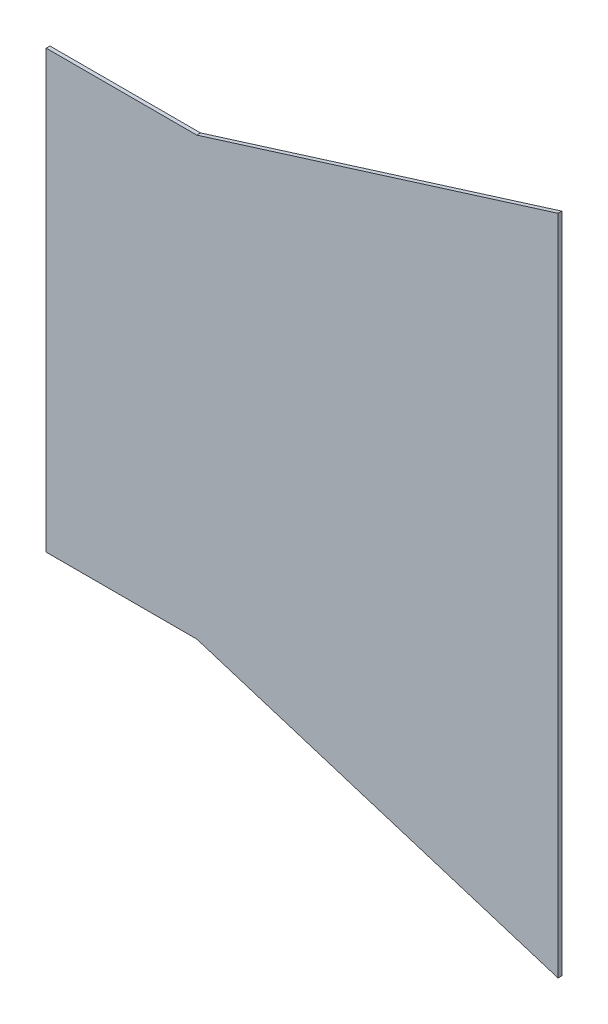
ISO-10303-21;
HEADER;
FILE_DESCRIPTION(('STEP AP214'),'2;1');
FILE_NAME('part.step','',(''),(''),'','','');
FILE_SCHEMA(('AUTOMOTIVE_DESIGN { 1 0 10303 214 1 1 1 1 }'));
ENDSEC;
DATA;
#1=APPLICATION_CONTEXT('core data for automotive mechanical design processes');
#2=APPLICATION_PROTOCOL_DEFINITION('international standard','automotive_design',2000,#1);
#3=PRODUCT_CONTEXT('',#1,'mechanical');
#4=PRODUCT('Part','Part','',(#3));
#5=PRODUCT_RELATED_PRODUCT_CATEGORY('part','',(#4));
#6=PRODUCT_DEFINITION_FORMATION('','',#4);
#7=PRODUCT_DEFINITION_CONTEXT('part definition',#1,'design');
#8=PRODUCT_DEFINITION('design','',#6,#7);
#9=PRODUCT_DEFINITION_SHAPE('','',#8);
#10=(LENGTH_UNIT() NAMED_UNIT(*) SI_UNIT(.MILLI.,.METRE.));
#11=(NAMED_UNIT(*) PLANE_ANGLE_UNIT() SI_UNIT($,.RADIAN.));
#12=(NAMED_UNIT(*) SI_UNIT($,.STERADIAN.) SOLID_ANGLE_UNIT());
#13=UNCERTAINTY_MEASURE_WITH_UNIT(LENGTH_MEASURE(1.E-05),#10,'distance_accuracy_value','');
#14=(GEOMETRIC_REPRESENTATION_CONTEXT(3) GLOBAL_UNCERTAINTY_ASSIGNED_CONTEXT((#13)) GLOBAL_UNIT_ASSIGNED_CONTEXT((#10,
#11,#12)) REPRESENTATION_CONTEXT('',''));
#15=CARTESIAN_POINT('',(0.,0.,0.));
#16=DIRECTION('',(0.,0.,1.));
#17=DIRECTION('',(1.,0.,0.));
#18=AXIS2_PLACEMENT_3D('',#15,#16,#17);
#19=CARTESIAN_POINT('',(127.,-368.3,3.175));
#20=DIRECTION('',(0.298274993135947,0.95447997803503,0.));
#21=DIRECTION('',(-0.95447997803503,0.298274993135947,0.));
#22=AXIS2_PLACEMENT_3D('',#19,#20,#21);
#23=PLANE('',#22);
#24=DIRECTION('',(0.95447997803503,-0.298274993135947,0.));
#25=VECTOR('',#24,1.);
#26=CARTESIAN_POINT('',(127.,-368.3,0.));
#27=LINE('',#26,#25);
#28=CARTESIAN_POINT('',(127.,-368.3,0.));
#29=VERTEX_POINT('',#28);
#30=CARTESIAN_POINT('',(431.8,-463.55,0.));
#31=VERTEX_POINT('',#30);
#32=EDGE_CURVE('E134',#29,#31,#27,.T.);
#33=ORIENTED_EDGE('',*,*,#32,.T.);
#34=DIRECTION('',(0.,0.,-1.));
#35=VECTOR('',#34,1.);
#36=CARTESIAN_POINT('',(431.8,-463.55,3.175));
#37=LINE('',#36,#35);
#38=CARTESIAN_POINT('',(431.8,-463.55,3.175));
#39=VERTEX_POINT('',#38);
#40=EDGE_CURVE('E11',#39,#31,#37,.T.);
#41=ORIENTED_EDGE('',*,*,#40,.F.);
#42=DIRECTION('',(0.95447997803503,-0.298274993135947,0.));
#43=VECTOR('',#42,1.);
#44=CARTESIAN_POINT('',(127.,-368.3,3.175));
#45=LINE('',#44,#43);
#46=CARTESIAN_POINT('',(127.,-368.3,3.175));
#47=VERTEX_POINT('',#46);
#48=EDGE_CURVE('E150',#47,#39,#45,.T.);
#49=ORIENTED_EDGE('',*,*,#48,.F.);
#50=DIRECTION('',(0.,0.,-1.));
#51=VECTOR('',#50,1.);
#52=CARTESIAN_POINT('',(127.,-368.3,3.175));
#53=LINE('',#52,#51);
#54=EDGE_CURVE('E130',#47,#29,#53,.T.);
#55=ORIENTED_EDGE('',*,*,#54,.T.);
#56=EDGE_LOOP('',(#33,#41,#49,#55));
#57=FACE_BOUND('',#56,.T.);
#58=ADVANCED_FACE('F45',(#57),#23,.F.);
#59=CARTESIAN_POINT('',(431.8,-463.55,3.175));
#60=DIRECTION('',(-1.,0.,0.));
#61=DIRECTION('',(0.,0.,1.));
#62=AXIS2_PLACEMENT_3D('',#59,#60,#61);
#63=PLANE('',#62);
#64=DIRECTION('',(0.,1.,0.));
#65=VECTOR('',#64,1.);
#66=CARTESIAN_POINT('',(431.8,-463.55,0.));
#67=LINE('',#66,#65);
#68=CARTESIAN_POINT('',(431.8,95.2499999999999,0.));
#69=VERTEX_POINT('',#68);
#70=EDGE_CURVE('E138',#31,#69,#67,.T.);
#71=ORIENTED_EDGE('',*,*,#70,.T.);
#72=DIRECTION('',(0.,0.,-1.));
#73=VECTOR('',#72,1.);
#74=CARTESIAN_POINT('',(431.8,95.2499999999999,3.175));
#75=LINE('',#74,#73);
#76=CARTESIAN_POINT('',(431.8,95.2499999999999,3.175));
#77=VERTEX_POINT('',#76);
#78=EDGE_CURVE('E54',#77,#69,#75,.T.);
#79=ORIENTED_EDGE('',*,*,#78,.F.);
#80=DIRECTION('',(0.,1.,0.));
#81=VECTOR('',#80,1.);
#82=CARTESIAN_POINT('',(431.8,-463.55,3.175));
#83=LINE('',#82,#81);
#84=EDGE_CURVE('E99',#39,#77,#83,.T.);
#85=ORIENTED_EDGE('',*,*,#84,.F.);
#86=ORIENTED_EDGE('',*,*,#40,.T.);
#87=EDGE_LOOP('',(#71,#79,#85,#86));
#88=FACE_BOUND('',#87,.T.);
#89=ADVANCED_FACE('F178',(#88),#63,.F.);
#90=CARTESIAN_POINT('',(431.8,95.2499999999999,3.175));
#91=DIRECTION('',(0.298274993135947,-0.95447997803503,0.));
#92=DIRECTION('',(0.95447997803503,0.298274993135947,0.));
#93=AXIS2_PLACEMENT_3D('',#90,#91,#92);
#94=PLANE('',#93);
#95=DIRECTION('',(-0.95447997803503,-0.298274993135947,0.));
#96=VECTOR('',#95,1.);
#97=CARTESIAN_POINT('',(431.8,95.2499999999999,0.));
#98=LINE('',#97,#96);
#99=CARTESIAN_POINT('',(127.,0.,0.));
#100=VERTEX_POINT('',#99);
#101=EDGE_CURVE('E141',#69,#100,#98,.T.);
#102=ORIENTED_EDGE('',*,*,#101,.T.);
#103=DIRECTION('',(0.,0.,-1.));
#104=VECTOR('',#103,1.);
#105=CARTESIAN_POINT('',(127.,0.,3.175));
#106=LINE('',#105,#104);
#107=CARTESIAN_POINT('',(127.,0.,3.175));
#108=VERTEX_POINT('',#107);
#109=EDGE_CURVE('E123',#108,#100,#106,.T.);
#110=ORIENTED_EDGE('',*,*,#109,.F.);
#111=DIRECTION('',(-0.95447997803503,-0.298274993135947,0.));
#112=VECTOR('',#111,1.);
#113=CARTESIAN_POINT('',(431.8,95.2499999999999,3.175));
#114=LINE('',#113,#112);
#115=EDGE_CURVE('E112',#77,#108,#114,.T.);
#116=ORIENTED_EDGE('',*,*,#115,.F.);
#117=ORIENTED_EDGE('',*,*,#78,.T.);
#118=EDGE_LOOP('',(#102,#110,#116,#117));
#119=FACE_BOUND('',#118,.T.);
#120=ADVANCED_FACE('F160',(#119),#94,.F.);
#121=CARTESIAN_POINT('',(0.,0.,3.175));
#122=DIRECTION('',(0.,-1.,0.));
#123=DIRECTION('',(0.,0.,-1.));
#124=AXIS2_PLACEMENT_3D('',#121,#122,#123);
#125=PLANE('',#124);
#126=DIRECTION('',(-1.,0.,0.));
#127=VECTOR('',#126,1.);
#128=CARTESIAN_POINT('',(0.,0.,0.));
#129=LINE('',#128,#127);
#130=CARTESIAN_POINT('',(0.,0.,0.));
#131=VERTEX_POINT('',#130);
#132=EDGE_CURVE('E121',#100,#131,#129,.T.);
#133=ORIENTED_EDGE('',*,*,#132,.T.);
#134=DIRECTION('',(0.,0.,-1.));
#135=VECTOR('',#134,1.);
#136=CARTESIAN_POINT('',(0.,0.,3.175));
#137=LINE('',#136,#135);
#138=CARTESIAN_POINT('',(0.,0.,3.175));
#139=VERTEX_POINT('',#138);
#140=EDGE_CURVE('E118',#139,#131,#137,.T.);
#141=ORIENTED_EDGE('',*,*,#140,.F.);
#142=DIRECTION('',(-1.,0.,0.));
#143=VECTOR('',#142,1.);
#144=CARTESIAN_POINT('',(0.,0.,3.175));
#145=LINE('',#144,#143);
#146=EDGE_CURVE('E106',#108,#139,#145,.T.);
#147=ORIENTED_EDGE('',*,*,#146,.F.);
#148=ORIENTED_EDGE('',*,*,#109,.T.);
#149=EDGE_LOOP('',(#133,#141,#147,#148));
#150=FACE_BOUND('',#149,.T.);
#151=ADVANCED_FACE('F119',(#150),#125,.F.);
#152=CARTESIAN_POINT('',(0.,-368.3,3.175));
#153=DIRECTION('',(1.,0.,0.));
#154=DIRECTION('',(0.,0.,-1.));
#155=AXIS2_PLACEMENT_3D('',#152,#153,#154);
#156=PLANE('',#155);
#157=DIRECTION('',(0.,-1.,0.));
#158=VECTOR('',#157,1.);
#159=CARTESIAN_POINT('',(0.,-368.3,0.));
#160=LINE('',#159,#158);
#161=CARTESIAN_POINT('',(0.,-368.3,0.));
#162=VERTEX_POINT('',#161);
#163=EDGE_CURVE('E85',#131,#162,#160,.T.);
#164=ORIENTED_EDGE('',*,*,#163,.T.);
#165=DIRECTION('',(0.,0.,-1.));
#166=VECTOR('',#165,1.);
#167=CARTESIAN_POINT('',(0.,-368.3,3.175));
#168=LINE('',#167,#166);
#169=CARTESIAN_POINT('',(0.,-368.3,3.175));
#170=VERTEX_POINT('',#169);
#171=EDGE_CURVE('E124',#170,#162,#168,.T.);
#172=ORIENTED_EDGE('',*,*,#171,.F.);
#173=DIRECTION('',(0.,-1.,0.));
#174=VECTOR('',#173,1.);
#175=CARTESIAN_POINT('',(0.,-368.3,3.175));
#176=LINE('',#175,#174);
#177=EDGE_CURVE('E110',#139,#170,#176,.T.);
#178=ORIENTED_EDGE('',*,*,#177,.F.);
#179=ORIENTED_EDGE('',*,*,#140,.T.);
#180=EDGE_LOOP('',(#164,#172,#178,#179));
#181=FACE_BOUND('',#180,.T.);
#182=ADVANCED_FACE('F126',(#181),#156,.F.);
#183=CARTESIAN_POINT('',(127.,-368.3,3.175));
#184=DIRECTION('',(0.,1.,0.));
#185=DIRECTION('',(0.,0.,1.));
#186=AXIS2_PLACEMENT_3D('',#183,#184,#185);
#187=PLANE('',#186);
#188=DIRECTION('',(1.,0.,0.));
#189=VECTOR('',#188,1.);
#190=CARTESIAN_POINT('',(127.,-368.3,0.));
#191=LINE('',#190,#189);
#192=EDGE_CURVE('E91',#162,#29,#191,.T.);
#193=ORIENTED_EDGE('',*,*,#192,.T.);
#194=ORIENTED_EDGE('',*,*,#54,.F.);
#195=DIRECTION('',(1.,0.,0.));
#196=VECTOR('',#195,1.);
#197=CARTESIAN_POINT('',(127.,-368.3,3.175));
#198=LINE('',#197,#196);
#199=EDGE_CURVE('E62',#170,#47,#198,.T.);
#200=ORIENTED_EDGE('',*,*,#199,.F.);
#201=ORIENTED_EDGE('',*,*,#171,.T.);
#202=EDGE_LOOP('',(#193,#194,#200,#201));
#203=FACE_BOUND('',#202,.T.);
#204=ADVANCED_FACE('F167',(#203),#187,.F.);
#205=CARTESIAN_POINT('',(0.,0.,3.175));
#206=DIRECTION('',(0.,0.,1.));
#207=DIRECTION('',(1.,0.,0.));
#208=AXIS2_PLACEMENT_3D('',#205,#206,#207);
#209=PLANE('',#208);
#210=ORIENTED_EDGE('',*,*,#48,.T.);
#211=ORIENTED_EDGE('',*,*,#84,.T.);
#212=ORIENTED_EDGE('',*,*,#115,.T.);
#213=ORIENTED_EDGE('',*,*,#146,.T.);
#214=ORIENTED_EDGE('',*,*,#177,.T.);
#215=ORIENTED_EDGE('',*,*,#199,.T.);
#216=EDGE_LOOP('',(#210,#211,#212,#213,#214,#215));
#217=FACE_BOUND('',#216,.T.);
#218=ADVANCED_FACE('F108',(#217),#209,.T.);
#219=CARTESIAN_POINT('',(0.,0.,0.));
#220=DIRECTION('',(0.,0.,1.));
#221=DIRECTION('',(1.,0.,0.));
#222=AXIS2_PLACEMENT_3D('',#219,#220,#221);
#223=PLANE('',#222);
#224=ORIENTED_EDGE('',*,*,#32,.F.);
#225=ORIENTED_EDGE('',*,*,#192,.F.);
#226=ORIENTED_EDGE('',*,*,#163,.F.);
#227=ORIENTED_EDGE('',*,*,#132,.F.);
#228=ORIENTED_EDGE('',*,*,#101,.F.);
#229=ORIENTED_EDGE('',*,*,#70,.F.);
#230=EDGE_LOOP('',(#224,#225,#226,#227,#228,#229));
#231=FACE_BOUND('',#230,.T.);
#232=ADVANCED_FACE('F163',(#231),#223,.F.);
#233=CLOSED_SHELL('',(#58,#89,#120,#151,#182,#204,#218,#232));
#234=MANIFOLD_SOLID_BREP('B2',#233);
#235=ADVANCED_BREP_SHAPE_REPRESENTATION('',(#18,#234),#14);
#236=SHAPE_DEFINITION_REPRESENTATION(#9,#235);
ENDSEC;
END-ISO-10303-21;
